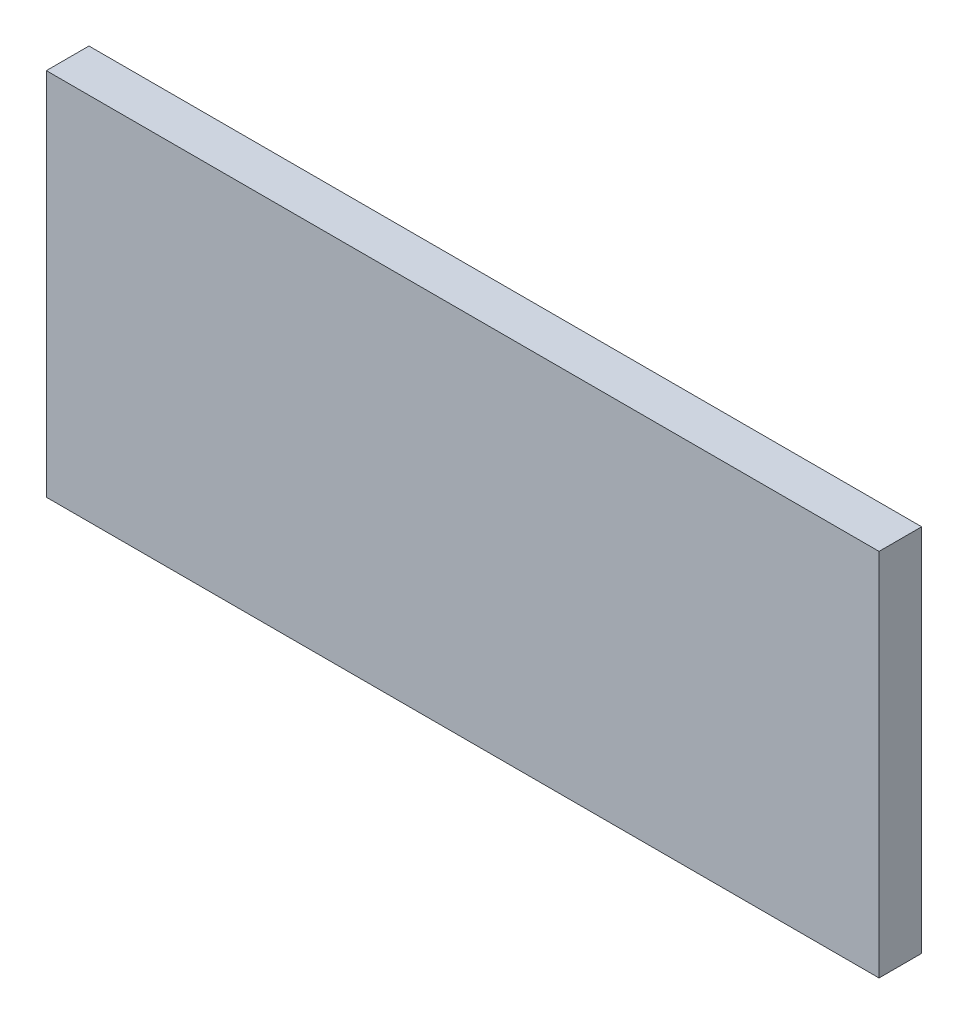
ISO-10303-21;
HEADER;
FILE_DESCRIPTION(('STEP AP214'),'2;1');
FILE_NAME('part.step','',(''),(''),'','','');
FILE_SCHEMA(('AUTOMOTIVE_DESIGN { 1 0 10303 214 1 1 1 1 }'));
ENDSEC;
DATA;
#1=APPLICATION_CONTEXT('core data for automotive mechanical design processes');
#2=APPLICATION_PROTOCOL_DEFINITION('international standard','automotive_design',2000,#1);
#3=PRODUCT_CONTEXT('',#1,'mechanical');
#4=PRODUCT('Part','Part','',(#3));
#5=PRODUCT_RELATED_PRODUCT_CATEGORY('part','',(#4));
#6=PRODUCT_DEFINITION_FORMATION('','',#4);
#7=PRODUCT_DEFINITION_CONTEXT('part definition',#1,'design');
#8=PRODUCT_DEFINITION('design','',#6,#7);
#9=PRODUCT_DEFINITION_SHAPE('','',#8);
#10=(LENGTH_UNIT() NAMED_UNIT(*) SI_UNIT(.MILLI.,.METRE.));
#11=(NAMED_UNIT(*) PLANE_ANGLE_UNIT() SI_UNIT($,.RADIAN.));
#12=(NAMED_UNIT(*) SI_UNIT($,.STERADIAN.) SOLID_ANGLE_UNIT());
#13=UNCERTAINTY_MEASURE_WITH_UNIT(LENGTH_MEASURE(1.E-05),#10,'distance_accuracy_value','');
#14=(GEOMETRIC_REPRESENTATION_CONTEXT(3) GLOBAL_UNCERTAINTY_ASSIGNED_CONTEXT((#13)) GLOBAL_UNIT_ASSIGNED_CONTEXT((#10,
#11,#12)) REPRESENTATION_CONTEXT('',''));
#15=CARTESIAN_POINT('',(0.,0.,0.));
#16=DIRECTION('',(0.,0.,1.));
#17=DIRECTION('',(1.,0.,0.));
#18=AXIS2_PLACEMENT_3D('',#15,#16,#17);
#19=CARTESIAN_POINT('',(146.5,130.,7.5));
#20=DIRECTION('',(-1.,0.,0.));
#21=DIRECTION('',(0.,0.,1.));
#22=AXIS2_PLACEMENT_3D('',#19,#20,#21);
#23=PLANE('',#22);
#24=DIRECTION('',(0.,0.,-1.));
#25=VECTOR('',#24,1.);
#26=CARTESIAN_POINT('',(146.5,0.,7.5));
#27=LINE('',#26,#25);
#28=CARTESIAN_POINT('',(146.5,0.,7.5));
#29=VERTEX_POINT('',#28);
#30=CARTESIAN_POINT('',(146.5,0.,-7.5));
#31=VERTEX_POINT('',#30);
#32=EDGE_CURVE('E107',#29,#31,#27,.T.);
#33=ORIENTED_EDGE('',*,*,#32,.T.);
#34=DIRECTION('',(0.,-1.,0.));
#35=VECTOR('',#34,1.);
#36=CARTESIAN_POINT('',(146.5,130.,-7.5));
#37=LINE('',#36,#35);
#38=CARTESIAN_POINT('',(146.5,130.,-7.5));
#39=VERTEX_POINT('',#38);
#40=EDGE_CURVE('E11',#39,#31,#37,.T.);
#41=ORIENTED_EDGE('',*,*,#40,.F.);
#42=DIRECTION('',(0.,0.,-1.));
#43=VECTOR('',#42,1.);
#44=CARTESIAN_POINT('',(146.5,130.,7.5));
#45=LINE('',#44,#43);
#46=CARTESIAN_POINT('',(146.5,130.,7.5));
#47=VERTEX_POINT('',#46);
#48=EDGE_CURVE('E91',#47,#39,#45,.T.);
#49=ORIENTED_EDGE('',*,*,#48,.F.);
#50=DIRECTION('',(0.,-1.,0.));
#51=VECTOR('',#50,1.);
#52=CARTESIAN_POINT('',(146.5,130.,7.5));
#53=LINE('',#52,#51);
#54=EDGE_CURVE('E103',#47,#29,#53,.T.);
#55=ORIENTED_EDGE('',*,*,#54,.T.);
#56=EDGE_LOOP('',(#33,#41,#49,#55));
#57=FACE_BOUND('',#56,.T.);
#58=ADVANCED_FACE('F39',(#57),#23,.F.);
#59=CARTESIAN_POINT('',(-146.5,130.,-7.5));
#60=DIRECTION('',(0.,0.,1.));
#61=DIRECTION('',(1.,0.,0.));
#62=AXIS2_PLACEMENT_3D('',#59,#60,#61);
#63=PLANE('',#62);
#64=DIRECTION('',(-1.,0.,0.));
#65=VECTOR('',#64,1.);
#66=CARTESIAN_POINT('',(-146.5,0.,-7.5));
#67=LINE('',#66,#65);
#68=CARTESIAN_POINT('',(-146.5,0.,-7.5));
#69=VERTEX_POINT('',#68);
#70=EDGE_CURVE('E96',#31,#69,#67,.T.);
#71=ORIENTED_EDGE('',*,*,#70,.T.);
#72=DIRECTION('',(0.,-1.,0.));
#73=VECTOR('',#72,1.);
#74=CARTESIAN_POINT('',(-146.5,130.,-7.5));
#75=LINE('',#74,#73);
#76=CARTESIAN_POINT('',(-146.5,130.,-7.5));
#77=VERTEX_POINT('',#76);
#78=EDGE_CURVE('E48',#77,#69,#75,.T.);
#79=ORIENTED_EDGE('',*,*,#78,.F.);
#80=DIRECTION('',(-1.,0.,0.));
#81=VECTOR('',#80,1.);
#82=CARTESIAN_POINT('',(-146.5,130.,-7.5));
#83=LINE('',#82,#81);
#84=EDGE_CURVE('E86',#39,#77,#83,.T.);
#85=ORIENTED_EDGE('',*,*,#84,.F.);
#86=ORIENTED_EDGE('',*,*,#40,.T.);
#87=EDGE_LOOP('',(#71,#79,#85,#86));
#88=FACE_BOUND('',#87,.T.);
#89=ADVANCED_FACE('F95',(#88),#63,.F.);
#90=CARTESIAN_POINT('',(-146.5,130.,7.5));
#91=DIRECTION('',(1.,0.,0.));
#92=DIRECTION('',(0.,0.,-1.));
#93=AXIS2_PLACEMENT_3D('',#90,#91,#92);
#94=PLANE('',#93);
#95=DIRECTION('',(0.,0.,1.));
#96=VECTOR('',#95,1.);
#97=CARTESIAN_POINT('',(-146.5,0.,7.5));
#98=LINE('',#97,#96);
#99=CARTESIAN_POINT('',(-146.5,0.,7.5));
#100=VERTEX_POINT('',#99);
#101=EDGE_CURVE('E73',#69,#100,#98,.T.);
#102=ORIENTED_EDGE('',*,*,#101,.T.);
#103=DIRECTION('',(0.,-1.,0.));
#104=VECTOR('',#103,1.);
#105=CARTESIAN_POINT('',(-146.5,130.,7.5));
#106=LINE('',#105,#104);
#107=CARTESIAN_POINT('',(-146.5,130.,7.5));
#108=VERTEX_POINT('',#107);
#109=EDGE_CURVE('E98',#108,#100,#106,.T.);
#110=ORIENTED_EDGE('',*,*,#109,.F.);
#111=DIRECTION('',(0.,0.,1.));
#112=VECTOR('',#111,1.);
#113=CARTESIAN_POINT('',(-146.5,130.,7.5));
#114=LINE('',#113,#112);
#115=EDGE_CURVE('E89',#77,#108,#114,.T.);
#116=ORIENTED_EDGE('',*,*,#115,.F.);
#117=ORIENTED_EDGE('',*,*,#78,.T.);
#118=EDGE_LOOP('',(#102,#110,#116,#117));
#119=FACE_BOUND('',#118,.T.);
#120=ADVANCED_FACE('F99',(#119),#94,.F.);
#121=CARTESIAN_POINT('',(-146.5,130.,7.5));
#122=DIRECTION('',(0.,0.,-1.));
#123=DIRECTION('',(-1.,0.,0.));
#124=AXIS2_PLACEMENT_3D('',#121,#122,#123);
#125=PLANE('',#124);
#126=DIRECTION('',(1.,0.,0.));
#127=VECTOR('',#126,1.);
#128=CARTESIAN_POINT('',(-146.5,0.,7.5));
#129=LINE('',#128,#127);
#130=EDGE_CURVE('E79',#100,#29,#129,.T.);
#131=ORIENTED_EDGE('',*,*,#130,.T.);
#132=ORIENTED_EDGE('',*,*,#54,.F.);
#133=DIRECTION('',(1.,0.,0.));
#134=VECTOR('',#133,1.);
#135=CARTESIAN_POINT('',(-146.5,130.,7.5));
#136=LINE('',#135,#134);
#137=EDGE_CURVE('E56',#108,#47,#136,.T.);
#138=ORIENTED_EDGE('',*,*,#137,.F.);
#139=ORIENTED_EDGE('',*,*,#109,.T.);
#140=EDGE_LOOP('',(#131,#132,#138,#139));
#141=FACE_BOUND('',#140,.T.);
#142=ADVANCED_FACE('F120',(#141),#125,.F.);
#143=CARTESIAN_POINT('',(0.,130.,0.));
#144=DIRECTION('',(0.,-1.,0.));
#145=DIRECTION('',(0.,0.,-1.));
#146=AXIS2_PLACEMENT_3D('',#143,#144,#145);
#147=PLANE('',#146);
#148=ORIENTED_EDGE('',*,*,#48,.T.);
#149=ORIENTED_EDGE('',*,*,#84,.T.);
#150=ORIENTED_EDGE('',*,*,#115,.T.);
#151=ORIENTED_EDGE('',*,*,#137,.T.);
#152=EDGE_LOOP('',(#148,#149,#150,#151));
#153=FACE_BOUND('',#152,.T.);
#154=ADVANCED_FACE('F87',(#153),#147,.F.);
#155=CARTESIAN_POINT('',(0.,0.,0.));
#156=DIRECTION('',(0.,-1.,0.));
#157=DIRECTION('',(0.,0.,-1.));
#158=AXIS2_PLACEMENT_3D('',#155,#156,#157);
#159=PLANE('',#158);
#160=ORIENTED_EDGE('',*,*,#32,.F.);
#161=ORIENTED_EDGE('',*,*,#130,.F.);
#162=ORIENTED_EDGE('',*,*,#101,.F.);
#163=ORIENTED_EDGE('',*,*,#70,.F.);
#164=EDGE_LOOP('',(#160,#161,#162,#163));
#165=FACE_BOUND('',#164,.T.);
#166=ADVANCED_FACE('F123',(#165),#159,.T.);
#167=CLOSED_SHELL('',(#58,#89,#120,#142,#154,#166));
#168=MANIFOLD_SOLID_BREP('B2',#167);
#169=ADVANCED_BREP_SHAPE_REPRESENTATION('',(#18,#168),#14);
#170=SHAPE_DEFINITION_REPRESENTATION(#9,#169);
ENDSEC;
END-ISO-10303-21;
